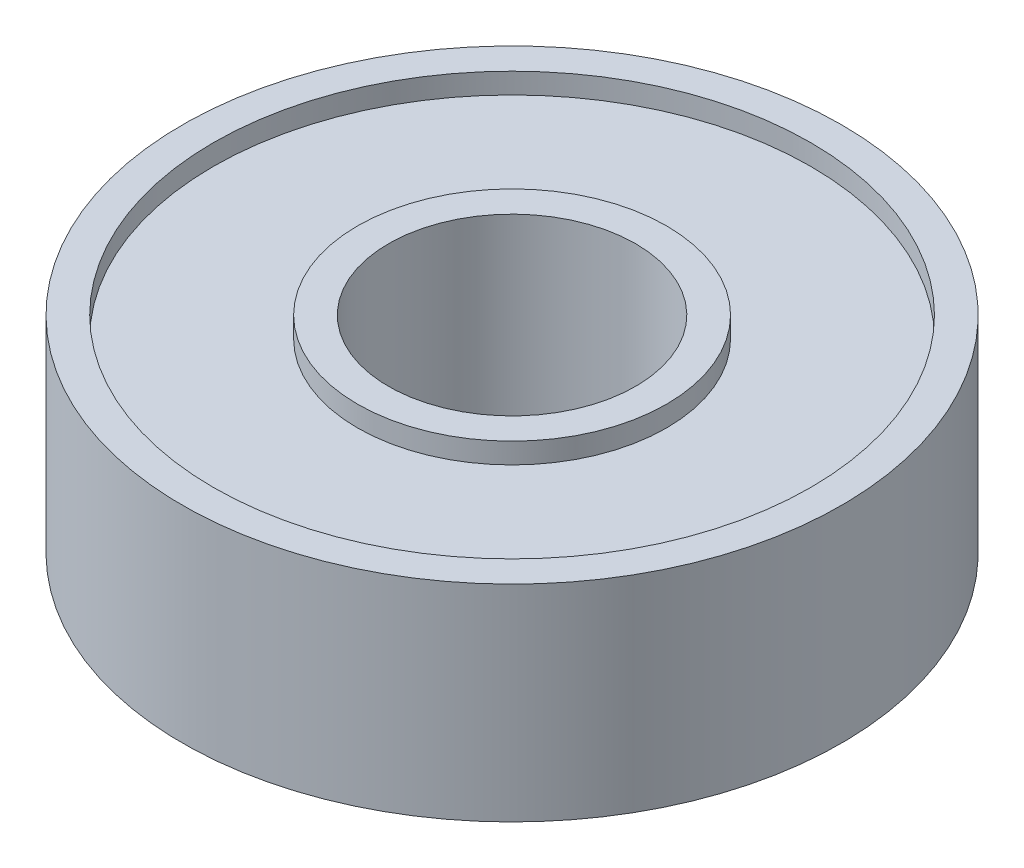
ISO-10303-21;
HEADER;
FILE_DESCRIPTION(('STEP AP214'),'2;1');
FILE_NAME('part.step','',(''),(''),'','','');
FILE_SCHEMA(('AUTOMOTIVE_DESIGN { 1 0 10303 214 1 1 1 1 }'));
ENDSEC;
DATA;
#1=APPLICATION_CONTEXT('core data for automotive mechanical design processes');
#2=APPLICATION_PROTOCOL_DEFINITION('international standard','automotive_design',2000,#1);
#3=PRODUCT_CONTEXT('',#1,'mechanical');
#4=PRODUCT('Part','Part','',(#3));
#5=PRODUCT_RELATED_PRODUCT_CATEGORY('part','',(#4));
#6=PRODUCT_DEFINITION_FORMATION('','',#4);
#7=PRODUCT_DEFINITION_CONTEXT('part definition',#1,'design');
#8=PRODUCT_DEFINITION('design','',#6,#7);
#9=PRODUCT_DEFINITION_SHAPE('','',#8);
#10=(LENGTH_UNIT() NAMED_UNIT(*) SI_UNIT(.MILLI.,.METRE.));
#11=(NAMED_UNIT(*) PLANE_ANGLE_UNIT() SI_UNIT($,.RADIAN.));
#12=(NAMED_UNIT(*) SI_UNIT($,.STERADIAN.) SOLID_ANGLE_UNIT());
#13=UNCERTAINTY_MEASURE_WITH_UNIT(LENGTH_MEASURE(1.E-05),#10,'distance_accuracy_value','');
#14=(GEOMETRIC_REPRESENTATION_CONTEXT(3) GLOBAL_UNCERTAINTY_ASSIGNED_CONTEXT((#13)) GLOBAL_UNIT_ASSIGNED_CONTEXT((#10,
#11,#12)) REPRESENTATION_CONTEXT('',''));
#15=CARTESIAN_POINT('',(0.,0.,0.));
#16=DIRECTION('',(0.,0.,1.));
#17=DIRECTION('',(1.,0.,0.));
#18=AXIS2_PLACEMENT_3D('',#15,#16,#17);
#19=CARTESIAN_POINT('',(-7.5,6.85670535698484,0.));
#20=DIRECTION('',(0.,1.,0.));
#21=DIRECTION('',(0.,0.,1.));
#22=AXIS2_PLACEMENT_3D('',#19,#20,#21);
#23=PLANE('',#22);
#24=CARTESIAN_POINT('',(0.,6.85670535698484,0.));
#25=DIRECTION('',(0.,-1.,0.));
#26=DIRECTION('',(0.,0.,-1.));
#27=AXIS2_PLACEMENT_3D('',#24,#25,#26);
#28=CIRCLE('',#27,6.);
#29=CARTESIAN_POINT('',(0.,6.85670535698484,-6.));
#30=VERTEX_POINT('',#29);
#31=EDGE_CURVE('E10',#30,#30,#28,.T.);
#32=ORIENTED_EDGE('',*,*,#31,.F.);
#33=EDGE_LOOP('',(#32));
#34=FACE_BOUND('',#33,.T.);
#35=CARTESIAN_POINT('',(0.,6.85670535698484,0.));
#36=DIRECTION('',(0.,-1.,0.));
#37=DIRECTION('',(0.,0.,-1.));
#38=AXIS2_PLACEMENT_3D('',#35,#36,#37);
#39=CIRCLE('',#38,7.5);
#40=CARTESIAN_POINT('',(0.,6.85670535698484,-7.5));
#41=VERTEX_POINT('',#40);
#42=EDGE_CURVE('E72',#41,#41,#39,.T.);
#43=ORIENTED_EDGE('',*,*,#42,.T.);
#44=EDGE_LOOP('',(#43));
#45=FACE_BOUND('',#44,.T.);
#46=ADVANCED_FACE('F32',(#34,#45),#23,.F.);
#47=CARTESIAN_POINT('',(0.,0.,0.));
#48=DIRECTION('',(0.,-1.,0.));
#49=DIRECTION('',(0.,0.,-1.));
#50=AXIS2_PLACEMENT_3D('',#47,#48,#49);
#51=CYLINDRICAL_SURFACE('',#50,6.);
#52=CARTESIAN_POINT('',(0.,16.8567053569848,0.));
#53=DIRECTION('',(0.,-1.,0.));
#54=DIRECTION('',(0.,0.,-1.));
#55=AXIS2_PLACEMENT_3D('',#52,#53,#54);
#56=CIRCLE('',#55,6.);
#57=CARTESIAN_POINT('',(0.,16.8567053569848,-6.));
#58=VERTEX_POINT('',#57);
#59=EDGE_CURVE('E38',#58,#58,#56,.T.);
#60=ORIENTED_EDGE('',*,*,#59,.F.);
#61=EDGE_LOOP('',(#60));
#62=FACE_BOUND('',#61,.T.);
#63=ORIENTED_EDGE('',*,*,#31,.T.);
#64=EDGE_LOOP('',(#63));
#65=FACE_BOUND('',#64,.T.);
#66=ADVANCED_FACE('F133',(#62,#65),#51,.F.);
#67=CARTESIAN_POINT('',(-6.,16.8567053569848,0.));
#68=DIRECTION('',(0.,-1.,0.));
#69=DIRECTION('',(0.,0.,-1.));
#70=AXIS2_PLACEMENT_3D('',#67,#68,#69);
#71=PLANE('',#70);
#72=CARTESIAN_POINT('',(0.,16.8567053569848,0.));
#73=DIRECTION('',(0.,-1.,0.));
#74=DIRECTION('',(0.,0.,-1.));
#75=AXIS2_PLACEMENT_3D('',#72,#73,#74);
#76=CIRCLE('',#75,7.5);
#77=CARTESIAN_POINT('',(0.,16.8567053569848,-7.5));
#78=VERTEX_POINT('',#77);
#79=EDGE_CURVE('E42',#78,#78,#76,.T.);
#80=ORIENTED_EDGE('',*,*,#79,.F.);
#81=EDGE_LOOP('',(#80));
#82=FACE_BOUND('',#81,.T.);
#83=ORIENTED_EDGE('',*,*,#59,.T.);
#84=EDGE_LOOP('',(#83));
#85=FACE_BOUND('',#84,.T.);
#86=ADVANCED_FACE('F128',(#82,#85),#71,.F.);
#87=CARTESIAN_POINT('',(0.,0.,0.));
#88=DIRECTION('',(0.,-1.,0.));
#89=DIRECTION('',(0.,0.,-1.));
#90=AXIS2_PLACEMENT_3D('',#87,#88,#89);
#91=CYLINDRICAL_SURFACE('',#90,7.5);
#92=CARTESIAN_POINT('',(0.,15.8567053569848,0.));
#93=DIRECTION('',(0.,-1.,0.));
#94=DIRECTION('',(0.,0.,-1.));
#95=AXIS2_PLACEMENT_3D('',#92,#93,#94);
#96=CIRCLE('',#95,7.5);
#97=CARTESIAN_POINT('',(0.,15.8567053569848,-7.5));
#98=VERTEX_POINT('',#97);
#99=EDGE_CURVE('E46',#98,#98,#96,.T.);
#100=ORIENTED_EDGE('',*,*,#99,.F.);
#101=EDGE_LOOP('',(#100));
#102=FACE_BOUND('',#101,.T.);
#103=ORIENTED_EDGE('',*,*,#79,.T.);
#104=EDGE_LOOP('',(#103));
#105=FACE_BOUND('',#104,.T.);
#106=ADVANCED_FACE('F122',(#102,#105),#91,.T.);
#107=CARTESIAN_POINT('',(-7.5,15.8567053569848,0.));
#108=DIRECTION('',(0.,-1.,0.));
#109=DIRECTION('',(0.,0.,-1.));
#110=AXIS2_PLACEMENT_3D('',#107,#108,#109);
#111=PLANE('',#110);
#112=CARTESIAN_POINT('',(0.,15.8567053569848,0.));
#113=DIRECTION('',(0.,-1.,0.));
#114=DIRECTION('',(0.,0.,-1.));
#115=AXIS2_PLACEMENT_3D('',#112,#113,#114);
#116=CIRCLE('',#115,14.5);
#117=CARTESIAN_POINT('',(0.,15.8567053569848,-14.5));
#118=VERTEX_POINT('',#117);
#119=EDGE_CURVE('E51',#118,#118,#116,.T.);
#120=ORIENTED_EDGE('',*,*,#119,.F.);
#121=EDGE_LOOP('',(#120));
#122=FACE_BOUND('',#121,.T.);
#123=ORIENTED_EDGE('',*,*,#99,.T.);
#124=EDGE_LOOP('',(#123));
#125=FACE_BOUND('',#124,.T.);
#126=ADVANCED_FACE('F116',(#122,#125),#111,.F.);
#127=CARTESIAN_POINT('',(0.,0.,0.));
#128=DIRECTION('',(0.,-1.,0.));
#129=DIRECTION('',(0.,0.,-1.));
#130=AXIS2_PLACEMENT_3D('',#127,#128,#129);
#131=CYLINDRICAL_SURFACE('',#130,14.5);
#132=CARTESIAN_POINT('',(0.,16.8567053569848,0.));
#133=DIRECTION('',(0.,-1.,0.));
#134=DIRECTION('',(0.,0.,-1.));
#135=AXIS2_PLACEMENT_3D('',#132,#133,#134);
#136=CIRCLE('',#135,14.5);
#137=CARTESIAN_POINT('',(0.,16.8567053569848,-14.5));
#138=VERTEX_POINT('',#137);
#139=EDGE_CURVE('E54',#138,#138,#136,.T.);
#140=ORIENTED_EDGE('',*,*,#139,.F.);
#141=EDGE_LOOP('',(#140));
#142=FACE_BOUND('',#141,.T.);
#143=ORIENTED_EDGE('',*,*,#119,.T.);
#144=EDGE_LOOP('',(#143));
#145=FACE_BOUND('',#144,.T.);
#146=ADVANCED_FACE('F110',(#142,#145),#131,.F.);
#147=CARTESIAN_POINT('',(-14.5,16.8567053569848,0.));
#148=DIRECTION('',(0.,-1.,0.));
#149=DIRECTION('',(0.,0.,-1.));
#150=AXIS2_PLACEMENT_3D('',#147,#148,#149);
#151=PLANE('',#150);
#152=CARTESIAN_POINT('',(0.,16.8567053569848,0.));
#153=DIRECTION('',(0.,-1.,0.));
#154=DIRECTION('',(0.,0.,-1.));
#155=AXIS2_PLACEMENT_3D('',#152,#153,#154);
#156=CIRCLE('',#155,16.);
#157=CARTESIAN_POINT('',(0.,16.8567053569848,-16.));
#158=VERTEX_POINT('',#157);
#159=EDGE_CURVE('E57',#158,#158,#156,.T.);
#160=ORIENTED_EDGE('',*,*,#159,.F.);
#161=EDGE_LOOP('',(#160));
#162=FACE_BOUND('',#161,.T.);
#163=ORIENTED_EDGE('',*,*,#139,.T.);
#164=EDGE_LOOP('',(#163));
#165=FACE_BOUND('',#164,.T.);
#166=ADVANCED_FACE('F104',(#162,#165),#151,.F.);
#167=CARTESIAN_POINT('',(0.,0.,0.));
#168=DIRECTION('',(0.,-1.,0.));
#169=DIRECTION('',(0.,0.,-1.));
#170=AXIS2_PLACEMENT_3D('',#167,#168,#169);
#171=CYLINDRICAL_SURFACE('',#170,16.);
#172=CARTESIAN_POINT('',(0.,6.85670535698484,0.));
#173=DIRECTION('',(0.,-1.,0.));
#174=DIRECTION('',(0.,0.,-1.));
#175=AXIS2_PLACEMENT_3D('',#172,#173,#174);
#176=CIRCLE('',#175,16.);
#177=CARTESIAN_POINT('',(0.,6.85670535698484,-16.));
#178=VERTEX_POINT('',#177);
#179=EDGE_CURVE('E60',#178,#178,#176,.T.);
#180=ORIENTED_EDGE('',*,*,#179,.F.);
#181=EDGE_LOOP('',(#180));
#182=FACE_BOUND('',#181,.T.);
#183=ORIENTED_EDGE('',*,*,#159,.T.);
#184=EDGE_LOOP('',(#183));
#185=FACE_BOUND('',#184,.T.);
#186=ADVANCED_FACE('F98',(#182,#185),#171,.T.);
#187=CARTESIAN_POINT('',(-16.,6.85670535698484,0.));
#188=DIRECTION('',(0.,1.,0.));
#189=DIRECTION('',(0.,0.,1.));
#190=AXIS2_PLACEMENT_3D('',#187,#188,#189);
#191=PLANE('',#190);
#192=CARTESIAN_POINT('',(0.,6.85670535698484,0.));
#193=DIRECTION('',(0.,-1.,0.));
#194=DIRECTION('',(0.,0.,-1.));
#195=AXIS2_PLACEMENT_3D('',#192,#193,#194);
#196=CIRCLE('',#195,14.5);
#197=CARTESIAN_POINT('',(0.,6.85670535698484,-14.5));
#198=VERTEX_POINT('',#197);
#199=EDGE_CURVE('E63',#198,#198,#196,.T.);
#200=ORIENTED_EDGE('',*,*,#199,.F.);
#201=EDGE_LOOP('',(#200));
#202=FACE_BOUND('',#201,.T.);
#203=ORIENTED_EDGE('',*,*,#179,.T.);
#204=EDGE_LOOP('',(#203));
#205=FACE_BOUND('',#204,.T.);
#206=ADVANCED_FACE('F92',(#202,#205),#191,.F.);
#207=CARTESIAN_POINT('',(0.,0.,0.));
#208=DIRECTION('',(0.,-1.,0.));
#209=DIRECTION('',(0.,0.,-1.));
#210=AXIS2_PLACEMENT_3D('',#207,#208,#209);
#211=CYLINDRICAL_SURFACE('',#210,14.5);
#212=CARTESIAN_POINT('',(0.,7.85670535698484,0.));
#213=DIRECTION('',(0.,-1.,0.));
#214=DIRECTION('',(0.,0.,-1.));
#215=AXIS2_PLACEMENT_3D('',#212,#213,#214);
#216=CIRCLE('',#215,14.5);
#217=CARTESIAN_POINT('',(0.,7.85670535698484,-14.5));
#218=VERTEX_POINT('',#217);
#219=EDGE_CURVE('E66',#218,#218,#216,.T.);
#220=ORIENTED_EDGE('',*,*,#219,.F.);
#221=EDGE_LOOP('',(#220));
#222=FACE_BOUND('',#221,.T.);
#223=ORIENTED_EDGE('',*,*,#199,.T.);
#224=EDGE_LOOP('',(#223));
#225=FACE_BOUND('',#224,.T.);
#226=ADVANCED_FACE('F86',(#222,#225),#211,.F.);
#227=CARTESIAN_POINT('',(-14.5,7.85670535698484,0.));
#228=DIRECTION('',(0.,1.,0.));
#229=DIRECTION('',(0.,0.,1.));
#230=AXIS2_PLACEMENT_3D('',#227,#228,#229);
#231=PLANE('',#230);
#232=CARTESIAN_POINT('',(0.,7.85670535698484,0.));
#233=DIRECTION('',(0.,-1.,0.));
#234=DIRECTION('',(0.,0.,-1.));
#235=AXIS2_PLACEMENT_3D('',#232,#233,#234);
#236=CIRCLE('',#235,7.5);
#237=CARTESIAN_POINT('',(0.,7.85670535698484,-7.5));
#238=VERTEX_POINT('',#237);
#239=EDGE_CURVE('E69',#238,#238,#236,.T.);
#240=ORIENTED_EDGE('',*,*,#239,.F.);
#241=EDGE_LOOP('',(#240));
#242=FACE_BOUND('',#241,.T.);
#243=ORIENTED_EDGE('',*,*,#219,.T.);
#244=EDGE_LOOP('',(#243));
#245=FACE_BOUND('',#244,.T.);
#246=ADVANCED_FACE('F80',(#242,#245),#231,.F.);
#247=CARTESIAN_POINT('',(0.,0.,0.));
#248=DIRECTION('',(0.,-1.,0.));
#249=DIRECTION('',(0.,0.,-1.));
#250=AXIS2_PLACEMENT_3D('',#247,#248,#249);
#251=CYLINDRICAL_SURFACE('',#250,7.5);
#252=ORIENTED_EDGE('',*,*,#42,.F.);
#253=EDGE_LOOP('',(#252));
#254=FACE_BOUND('',#253,.T.);
#255=ORIENTED_EDGE('',*,*,#239,.T.);
#256=EDGE_LOOP('',(#255));
#257=FACE_BOUND('',#256,.T.);
#258=ADVANCED_FACE('F77',(#254,#257),#251,.T.);
#259=CLOSED_SHELL('',(#46,#66,#86,#106,#126,#146,#166,#186,#206,#226,#246,#258));
#260=MANIFOLD_SOLID_BREP('B2',#259);
#261=ADVANCED_BREP_SHAPE_REPRESENTATION('',(#18,#260),#14);
#262=SHAPE_DEFINITION_REPRESENTATION(#9,#261);
ENDSEC;
END-ISO-10303-21;
